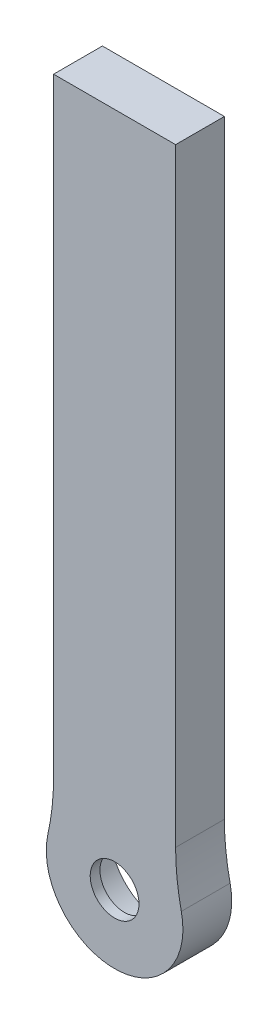
ISO-10303-21;
HEADER;
FILE_DESCRIPTION(('STEP AP214'),'2;1');
FILE_NAME('part.step','',(''),(''),'','','');
FILE_SCHEMA(('AUTOMOTIVE_DESIGN { 1 0 10303 214 1 1 1 1 }'));
ENDSEC;
DATA;
#1=APPLICATION_CONTEXT('core data for automotive mechanical design processes');
#2=APPLICATION_PROTOCOL_DEFINITION('international standard','automotive_design',2000,#1);
#3=PRODUCT_CONTEXT('',#1,'mechanical');
#4=PRODUCT('Part','Part','',(#3));
#5=PRODUCT_RELATED_PRODUCT_CATEGORY('part','',(#4));
#6=PRODUCT_DEFINITION_FORMATION('','',#4);
#7=PRODUCT_DEFINITION_CONTEXT('part definition',#1,'design');
#8=PRODUCT_DEFINITION('design','',#6,#7);
#9=PRODUCT_DEFINITION_SHAPE('','',#8);
#10=(LENGTH_UNIT() NAMED_UNIT(*) SI_UNIT(.MILLI.,.METRE.));
#11=(NAMED_UNIT(*) PLANE_ANGLE_UNIT() SI_UNIT($,.RADIAN.));
#12=(NAMED_UNIT(*) SI_UNIT($,.STERADIAN.) SOLID_ANGLE_UNIT());
#13=UNCERTAINTY_MEASURE_WITH_UNIT(LENGTH_MEASURE(1.E-05),#10,'distance_accuracy_value','');
#14=(GEOMETRIC_REPRESENTATION_CONTEXT(3) GLOBAL_UNCERTAINTY_ASSIGNED_CONTEXT((#13)) GLOBAL_UNIT_ASSIGNED_CONTEXT((#10,
#11,#12)) REPRESENTATION_CONTEXT('',''));
#15=CARTESIAN_POINT('',(0.,0.,0.));
#16=DIRECTION('',(0.,0.,1.));
#17=DIRECTION('',(1.,0.,0.));
#18=AXIS2_PLACEMENT_3D('',#15,#16,#17);
#19=CARTESIAN_POINT('',(0.,0.,0.));
#20=DIRECTION('',(0.,0.,1.));
#21=DIRECTION('',(1.,0.,0.));
#22=AXIS2_PLACEMENT_3D('',#19,#20,#21);
#23=PLANE('',#22);
#24=CARTESIAN_POINT('',(8.5,128.,0.));
#25=DIRECTION('',(0.,0.,1.));
#26=DIRECTION('',(1.,0.,0.));
#27=AXIS2_PLACEMENT_3D('',#24,#25,#26);
#28=CIRCLE('',#27,4.);
#29=CARTESIAN_POINT('',(8.5,132.,0.));
#30=VERTEX_POINT('',#29);
#31=CARTESIAN_POINT('',(12.5,128.,0.));
#32=VERTEX_POINT('',#31);
#33=EDGE_CURVE('E48',#30,#32,#28,.F.);
#34=ORIENTED_EDGE('',*,*,#33,.F.);
#35=DIRECTION('',(1.,0.,0.));
#36=VECTOR('',#35,1.);
#37=CARTESIAN_POINT('',(0.,132.,0.));
#38=LINE('',#37,#36);
#39=CARTESIAN_POINT('',(-8.5,132.,0.));
#40=VERTEX_POINT('',#39);
#41=EDGE_CURVE('E60',#30,#40,#38,.F.);
#42=ORIENTED_EDGE('',*,*,#41,.T.);
#43=CARTESIAN_POINT('',(-8.5,128.,0.));
#44=DIRECTION('',(0.,0.,1.));
#45=DIRECTION('',(1.,0.,0.));
#46=AXIS2_PLACEMENT_3D('',#43,#44,#45);
#47=CIRCLE('',#46,4.);
#48=CARTESIAN_POINT('',(-12.5,128.,0.));
#49=VERTEX_POINT('',#48);
#50=EDGE_CURVE('E260',#49,#40,#47,.F.);
#51=ORIENTED_EDGE('',*,*,#50,.F.);
#52=DIRECTION('',(0.,1.,0.));
#53=VECTOR('',#52,1.);
#54=CARTESIAN_POINT('',(-12.5,0.,0.));
#55=LINE('',#54,#53);
#56=CARTESIAN_POINT('',(-12.5,138.478281378197,0.));
#57=VERTEX_POINT('',#56);
#58=EDGE_CURVE('E183',#49,#57,#55,.T.);
#59=ORIENTED_EDGE('',*,*,#58,.T.);
#60=DIRECTION('',(1.,0.,0.));
#61=VECTOR('',#60,1.);
#62=CARTESIAN_POINT('',(0.,138.478281378197,0.));
#63=LINE('',#62,#61);
#64=CARTESIAN_POINT('',(12.5,138.478281378197,0.));
#65=VERTEX_POINT('',#64);
#66=EDGE_CURVE('E209',#57,#65,#63,.T.);
#67=ORIENTED_EDGE('',*,*,#66,.T.);
#68=DIRECTION('',(0.,1.,0.));
#69=VECTOR('',#68,1.);
#70=CARTESIAN_POINT('',(12.5,0.,0.));
#71=LINE('',#70,#69);
#72=EDGE_CURVE('E205',#32,#65,#71,.T.);
#73=ORIENTED_EDGE('',*,*,#72,.F.);
#74=EDGE_LOOP('',(#34,#42,#51,#59,#67,#73));
#75=FACE_BOUND('',#74,.T.);
#76=ADVANCED_FACE('F39',(#75),#23,.F.);
#77=CARTESIAN_POINT('',(-12.5,0.,10.));
#78=DIRECTION('',(-1.,0.,0.));
#79=DIRECTION('',(0.,0.,1.));
#80=AXIS2_PLACEMENT_3D('',#77,#78,#79);
#81=PLANE('',#80);
#82=CARTESIAN_POINT('',(-12.5,13.7749773139559,0.));
#83=VERTEX_POINT('',#82);
#84=CARTESIAN_POINT('',(-12.5,18.,0.));
#85=VERTEX_POINT('',#84);
#86=EDGE_CURVE('E198',#83,#85,#55,.T.);
#87=ORIENTED_EDGE('',*,*,#86,.F.);
#88=DIRECTION('',(0.,0.,-1.));
#89=VECTOR('',#88,1.);
#90=CARTESIAN_POINT('',(-12.5,13.7749773139559,10.));
#91=LINE('',#90,#89);
#92=CARTESIAN_POINT('',(-12.5,13.7749773139559,10.));
#93=VERTEX_POINT('',#92);
#94=EDGE_CURVE('E228',#83,#93,#91,.F.);
#95=ORIENTED_EDGE('',*,*,#94,.T.);
#96=DIRECTION('',(0.,1.,0.));
#97=VECTOR('',#96,1.);
#98=CARTESIAN_POINT('',(-12.5,0.,10.));
#99=LINE('',#98,#97);
#100=CARTESIAN_POINT('',(-12.5,138.478281378197,10.));
#101=VERTEX_POINT('',#100);
#102=EDGE_CURVE('E186',#93,#101,#99,.T.);
#103=ORIENTED_EDGE('',*,*,#102,.T.);
#104=DIRECTION('',(0.,0.,-1.));
#105=VECTOR('',#104,1.);
#106=CARTESIAN_POINT('',(-12.5,138.478281378197,10.));
#107=LINE('',#106,#105);
#108=EDGE_CURVE('E197',#101,#57,#107,.T.);
#109=ORIENTED_EDGE('',*,*,#108,.T.);
#110=ORIENTED_EDGE('',*,*,#58,.F.);
#111=EDGE_CURVE('E202',#85,#49,#55,.T.);
#112=ORIENTED_EDGE('',*,*,#111,.F.);
#113=EDGE_LOOP('',(#87,#95,#103,#109,#110,#112));
#114=FACE_BOUND('',#113,.T.);
#115=ADVANCED_FACE('F321',(#114),#81,.T.);
#116=CARTESIAN_POINT('',(0.,0.,10.));
#117=DIRECTION('',(0.,0.,-1.));
#118=DIRECTION('',(-1.,0.,0.));
#119=AXIS2_PLACEMENT_3D('',#116,#117,#118);
#120=CYLINDRICAL_SURFACE('',#119,14.);
#121=CARTESIAN_POINT('',(0.,0.,10.));
#122=DIRECTION('',(0.,0.,1.));
#123=DIRECTION('',(1.,0.,0.));
#124=AXIS2_PLACEMENT_3D('',#121,#122,#123);
#125=CIRCLE('',#124,14.);
#126=CARTESIAN_POINT('',(-13.671875,3.01327628742785,10.));
#127=VERTEX_POINT('',#126);
#128=CARTESIAN_POINT('',(13.671875,3.01327628742785,10.));
#129=VERTEX_POINT('',#128);
#130=EDGE_CURVE('E188',#127,#129,#125,.T.);
#131=ORIENTED_EDGE('',*,*,#130,.F.);
#132=DIRECTION('',(0.,0.,-1.));
#133=VECTOR('',#132,1.);
#134=CARTESIAN_POINT('',(-13.671875,3.01327628742785,10.));
#135=LINE('',#134,#133);
#136=CARTESIAN_POINT('',(-13.671875,3.01327628742785,0.));
#137=VERTEX_POINT('',#136);
#138=EDGE_CURVE('E225',#127,#137,#135,.T.);
#139=ORIENTED_EDGE('',*,*,#138,.T.);
#140=CARTESIAN_POINT('',(0.,0.,0.));
#141=DIRECTION('',(0.,0.,1.));
#142=DIRECTION('',(1.,0.,0.));
#143=AXIS2_PLACEMENT_3D('',#140,#141,#142);
#144=CIRCLE('',#143,14.);
#145=CARTESIAN_POINT('',(13.671875,3.01327628742785,0.));
#146=VERTEX_POINT('',#145);
#147=EDGE_CURVE('E201',#137,#146,#144,.T.);
#148=ORIENTED_EDGE('',*,*,#147,.T.);
#149=DIRECTION('',(0.,0.,-1.));
#150=VECTOR('',#149,1.);
#151=CARTESIAN_POINT('',(13.671875,3.01327628742785,10.));
#152=LINE('',#151,#150);
#153=EDGE_CURVE('E223',#146,#129,#152,.F.);
#154=ORIENTED_EDGE('',*,*,#153,.T.);
#155=EDGE_LOOP('',(#131,#139,#148,#154));
#156=FACE_BOUND('',#155,.T.);
#157=ADVANCED_FACE('F327',(#156),#120,.T.);
#158=CARTESIAN_POINT('',(12.5,0.,10.));
#159=DIRECTION('',(-1.,0.,0.));
#160=DIRECTION('',(0.,0.,1.));
#161=AXIS2_PLACEMENT_3D('',#158,#159,#160);
#162=PLANE('',#161);
#163=DIRECTION('',(0.,1.,0.));
#164=VECTOR('',#163,1.);
#165=CARTESIAN_POINT('',(12.5,0.,10.));
#166=LINE('',#165,#164);
#167=CARTESIAN_POINT('',(12.5,13.7749773139559,10.));
#168=VERTEX_POINT('',#167);
#169=CARTESIAN_POINT('',(12.5,138.478281378197,10.));
#170=VERTEX_POINT('',#169);
#171=EDGE_CURVE('E192',#168,#170,#166,.T.);
#172=ORIENTED_EDGE('',*,*,#171,.F.);
#173=DIRECTION('',(0.,0.,1.));
#174=VECTOR('',#173,1.);
#175=CARTESIAN_POINT('',(12.5,13.7749773139559,0.));
#176=LINE('',#175,#174);
#177=CARTESIAN_POINT('',(12.5,13.7749773139559,0.));
#178=VERTEX_POINT('',#177);
#179=EDGE_CURVE('E230',#168,#178,#176,.F.);
#180=ORIENTED_EDGE('',*,*,#179,.T.);
#181=CARTESIAN_POINT('',(12.5,18.,0.));
#182=VERTEX_POINT('',#181);
#183=EDGE_CURVE('E206',#178,#182,#71,.T.);
#184=ORIENTED_EDGE('',*,*,#183,.T.);
#185=EDGE_CURVE('E210',#182,#32,#71,.T.);
#186=ORIENTED_EDGE('',*,*,#185,.T.);
#187=ORIENTED_EDGE('',*,*,#72,.T.);
#188=DIRECTION('',(0.,0.,-1.));
#189=VECTOR('',#188,1.);
#190=CARTESIAN_POINT('',(12.5,138.478281378197,10.));
#191=LINE('',#190,#189);
#192=EDGE_CURVE('E217',#170,#65,#191,.T.);
#193=ORIENTED_EDGE('',*,*,#192,.F.);
#194=EDGE_LOOP('',(#172,#180,#184,#186,#187,#193));
#195=FACE_BOUND('',#194,.T.);
#196=ADVANCED_FACE('F356',(#195),#162,.F.);
#197=CARTESIAN_POINT('',(0.,138.478281378197,10.));
#198=DIRECTION('',(0.,1.,0.));
#199=DIRECTION('',(0.,0.,1.));
#200=AXIS2_PLACEMENT_3D('',#197,#198,#199);
#201=PLANE('',#200);
#202=ORIENTED_EDGE('',*,*,#66,.F.);
#203=ORIENTED_EDGE('',*,*,#108,.F.);
#204=DIRECTION('',(1.,0.,0.));
#205=VECTOR('',#204,1.);
#206=CARTESIAN_POINT('',(0.,138.478281378197,10.));
#207=LINE('',#206,#205);
#208=EDGE_CURVE('E194',#101,#170,#207,.T.);
#209=ORIENTED_EDGE('',*,*,#208,.T.);
#210=ORIENTED_EDGE('',*,*,#192,.T.);
#211=EDGE_LOOP('',(#202,#203,#209,#210));
#212=FACE_BOUND('',#211,.T.);
#213=ADVANCED_FACE('F351',(#212),#201,.T.);
#214=CARTESIAN_POINT('',(0.,0.,10.));
#215=DIRECTION('',(0.,0.,-1.));
#216=DIRECTION('',(-1.,0.,0.));
#217=AXIS2_PLACEMENT_3D('',#214,#215,#216);
#218=CYLINDRICAL_SURFACE('',#217,11.);
#219=CARTESIAN_POINT('',(0.,0.,8.));
#220=DIRECTION('',(0.,0.,-1.));
#221=DIRECTION('',(-1.,0.,0.));
#222=AXIS2_PLACEMENT_3D('',#219,#220,#221);
#223=CIRCLE('',#222,11.);
#224=CARTESIAN_POINT('',(-11.,0.,8.));
#225=VERTEX_POINT('',#224);
#226=EDGE_CURVE('E220',#225,#225,#223,.T.);
#227=ORIENTED_EDGE('',*,*,#226,.F.);
#228=EDGE_LOOP('',(#227));
#229=FACE_BOUND('',#228,.T.);
#230=CARTESIAN_POINT('',(0.,0.,0.));
#231=DIRECTION('',(0.,0.,1.));
#232=DIRECTION('',(1.,0.,0.));
#233=AXIS2_PLACEMENT_3D('',#230,#231,#232);
#234=CIRCLE('',#233,11.);
#235=CARTESIAN_POINT('',(11.,0.,0.));
#236=VERTEX_POINT('',#235);
#237=EDGE_CURVE('E189',#236,#236,#234,.T.);
#238=ORIENTED_EDGE('',*,*,#237,.F.);
#239=EDGE_LOOP('',(#238));
#240=FACE_BOUND('',#239,.T.);
#241=ADVANCED_FACE('F343',(#229,#240),#218,.F.);
#242=CARTESIAN_POINT('',(0.,0.,10.));
#243=DIRECTION('',(0.,0.,1.));
#244=DIRECTION('',(1.,0.,0.));
#245=AXIS2_PLACEMENT_3D('',#242,#243,#244);
#246=PLANE('',#245);
#247=ORIENTED_EDGE('',*,*,#102,.F.);
#248=CARTESIAN_POINT('',(-62.5,13.7749773139559,10.));
#249=DIRECTION('',(0.,0.,1.));
#250=DIRECTION('',(1.,0.,0.));
#251=AXIS2_PLACEMENT_3D('',#248,#249,#250);
#252=CIRCLE('',#251,50.);
#253=EDGE_CURVE('E235',#93,#127,#252,.F.);
#254=ORIENTED_EDGE('',*,*,#253,.T.);
#255=ORIENTED_EDGE('',*,*,#130,.T.);
#256=CARTESIAN_POINT('',(62.5,13.7749773139559,10.));
#257=DIRECTION('',(0.,0.,1.));
#258=DIRECTION('',(1.,0.,0.));
#259=AXIS2_PLACEMENT_3D('',#256,#257,#258);
#260=CIRCLE('',#259,50.);
#261=EDGE_CURVE('E239',#129,#168,#260,.F.);
#262=ORIENTED_EDGE('',*,*,#261,.T.);
#263=ORIENTED_EDGE('',*,*,#171,.T.);
#264=ORIENTED_EDGE('',*,*,#208,.F.);
#265=EDGE_LOOP('',(#247,#254,#255,#262,#263,#264));
#266=FACE_BOUND('',#265,.T.);
#267=CARTESIAN_POINT('',(0.,0.,10.));
#268=DIRECTION('',(0.,0.,-1.));
#269=DIRECTION('',(-1.,0.,0.));
#270=AXIS2_PLACEMENT_3D('',#267,#268,#269);
#271=CIRCLE('',#270,5.);
#272=CARTESIAN_POINT('',(-5.,0.,10.));
#273=VERTEX_POINT('',#272);
#274=EDGE_CURVE('E179',#273,#273,#271,.T.);
#275=ORIENTED_EDGE('',*,*,#274,.T.);
#276=EDGE_LOOP('',(#275));
#277=FACE_BOUND('',#276,.T.);
#278=ADVANCED_FACE('F334',(#266,#277),#246,.T.);
#279=ORIENTED_EDGE('',*,*,#86,.T.);
#280=DIRECTION('',(-1.,0.,0.));
#281=VECTOR('',#280,1.);
#282=CARTESIAN_POINT('',(0.,18.,0.));
#283=LINE('',#282,#281);
#284=EDGE_CURVE('E12',#85,#182,#283,.F.);
#285=ORIENTED_EDGE('',*,*,#284,.T.);
#286=ORIENTED_EDGE('',*,*,#183,.F.);
#287=CARTESIAN_POINT('',(62.5,13.7749773139559,0.));
#288=DIRECTION('',(0.,0.,1.));
#289=DIRECTION('',(1.,0.,0.));
#290=AXIS2_PLACEMENT_3D('',#287,#288,#289);
#291=CIRCLE('',#290,50.);
#292=EDGE_CURVE('E237',#178,#146,#291,.T.);
#293=ORIENTED_EDGE('',*,*,#292,.T.);
#294=ORIENTED_EDGE('',*,*,#147,.F.);
#295=CARTESIAN_POINT('',(-62.5,13.7749773139559,0.));
#296=DIRECTION('',(0.,0.,1.));
#297=DIRECTION('',(1.,0.,0.));
#298=AXIS2_PLACEMENT_3D('',#295,#296,#297);
#299=CIRCLE('',#298,50.);
#300=EDGE_CURVE('E233',#137,#83,#299,.T.);
#301=ORIENTED_EDGE('',*,*,#300,.T.);
#302=EDGE_LOOP('',(#279,#285,#286,#293,#294,#301));
#303=FACE_BOUND('',#302,.T.);
#304=ORIENTED_EDGE('',*,*,#237,.T.);
#305=EDGE_LOOP('',(#304));
#306=FACE_BOUND('',#305,.T.);
#307=ADVANCED_FACE('F323',(#303,#306),#23,.F.);
#308=CARTESIAN_POINT('',(0.,0.,8.));
#309=DIRECTION('',(0.,0.,-1.));
#310=DIRECTION('',(-1.,0.,0.));
#311=AXIS2_PLACEMENT_3D('',#308,#309,#310);
#312=PLANE('',#311);
#313=ORIENTED_EDGE('',*,*,#226,.T.);
#314=EDGE_LOOP('',(#313));
#315=FACE_BOUND('',#314,.T.);
#316=CARTESIAN_POINT('',(0.,0.,8.));
#317=DIRECTION('',(0.,0.,-1.));
#318=DIRECTION('',(-1.,0.,0.));
#319=AXIS2_PLACEMENT_3D('',#316,#317,#318);
#320=CIRCLE('',#319,5.);
#321=CARTESIAN_POINT('',(-5.,0.,8.));
#322=VERTEX_POINT('',#321);
#323=EDGE_CURVE('E180',#322,#322,#320,.T.);
#324=ORIENTED_EDGE('',*,*,#323,.F.);
#325=EDGE_LOOP('',(#324));
#326=FACE_BOUND('',#325,.T.);
#327=ADVANCED_FACE('F333',(#315,#326),#312,.T.);
#328=CARTESIAN_POINT('',(0.,0.,8.));
#329=DIRECTION('',(0.,0.,1.));
#330=DIRECTION('',(1.,0.,0.));
#331=AXIS2_PLACEMENT_3D('',#328,#329,#330);
#332=CYLINDRICAL_SURFACE('',#331,5.);
#333=ORIENTED_EDGE('',*,*,#323,.T.);
#334=EDGE_LOOP('',(#333));
#335=FACE_BOUND('',#334,.T.);
#336=ORIENTED_EDGE('',*,*,#274,.F.);
#337=EDGE_LOOP('',(#336));
#338=FACE_BOUND('',#337,.T.);
#339=ADVANCED_FACE('F340',(#335,#338),#332,.F.);
#340=CARTESIAN_POINT('',(0.,0.,8.));
#341=DIRECTION('',(0.,0.,1.));
#342=DIRECTION('',(1.,0.,0.));
#343=AXIS2_PLACEMENT_3D('',#340,#341,#342);
#344=PLANE('',#343);
#345=DIRECTION('',(0.,1.,0.));
#346=VECTOR('',#345,1.);
#347=CARTESIAN_POINT('',(-10.5,130.,8.00000000000001));
#348=LINE('',#347,#346);
#349=CARTESIAN_POINT('',(-10.5,20.,8.00000000000001));
#350=VERTEX_POINT('',#349);
#351=CARTESIAN_POINT('',(-10.5,128.,8.00000000000001));
#352=VERTEX_POINT('',#351);
#353=EDGE_CURVE('E146',#350,#352,#348,.T.);
#354=ORIENTED_EDGE('',*,*,#353,.T.);
#355=CARTESIAN_POINT('',(-8.5,128.,8.00000000000001));
#356=DIRECTION('',(0.,0.,1.));
#357=DIRECTION('',(1.,0.,0.));
#358=AXIS2_PLACEMENT_3D('',#355,#356,#357);
#359=CIRCLE('',#358,2.);
#360=CARTESIAN_POINT('',(-8.5,130.,8.00000000000001));
#361=VERTEX_POINT('',#360);
#362=EDGE_CURVE('E253',#352,#361,#359,.F.);
#363=ORIENTED_EDGE('',*,*,#362,.T.);
#364=DIRECTION('',(1.,0.,0.));
#365=VECTOR('',#364,1.);
#366=CARTESIAN_POINT('',(10.5,130.,8.00000000000001));
#367=LINE('',#366,#365);
#368=CARTESIAN_POINT('',(8.5,130.,8.00000000000001));
#369=VERTEX_POINT('',#368);
#370=EDGE_CURVE('E156',#361,#369,#367,.T.);
#371=ORIENTED_EDGE('',*,*,#370,.T.);
#372=CARTESIAN_POINT('',(8.5,128.,8.00000000000001));
#373=DIRECTION('',(0.,0.,1.));
#374=DIRECTION('',(1.,0.,0.));
#375=AXIS2_PLACEMENT_3D('',#372,#373,#374);
#376=CIRCLE('',#375,2.);
#377=CARTESIAN_POINT('',(10.5,128.,8.00000000000001));
#378=VERTEX_POINT('',#377);
#379=EDGE_CURVE('E251',#369,#378,#376,.F.);
#380=ORIENTED_EDGE('',*,*,#379,.T.);
#381=DIRECTION('',(0.,-1.,0.));
#382=VECTOR('',#381,1.);
#383=CARTESIAN_POINT('',(10.5,130.,8.00000000000001));
#384=LINE('',#383,#382);
#385=CARTESIAN_POINT('',(10.5,20.,8.00000000000001));
#386=VERTEX_POINT('',#385);
#387=EDGE_CURVE('E169',#378,#386,#384,.T.);
#388=ORIENTED_EDGE('',*,*,#387,.T.);
#389=DIRECTION('',(-1.,0.,0.));
#390=VECTOR('',#389,1.);
#391=CARTESIAN_POINT('',(10.5,20.,8.00000000000001));
#392=LINE('',#391,#390);
#393=EDGE_CURVE('E162',#386,#350,#392,.T.);
#394=ORIENTED_EDGE('',*,*,#393,.T.);
#395=EDGE_LOOP('',(#354,#363,#371,#380,#388,#394));
#396=FACE_BOUND('',#395,.T.);
#397=ADVANCED_FACE('F167',(#396),#344,.F.);
#398=CARTESIAN_POINT('',(10.5,20.,121.986606342009));
#399=DIRECTION('',(0.,-1.,0.));
#400=DIRECTION('',(0.,0.,-1.));
#401=AXIS2_PLACEMENT_3D('',#398,#399,#400);
#402=PLANE('',#401);
#403=DIRECTION('',(0.,0.,-1.));
#404=VECTOR('',#403,1.);
#405=CARTESIAN_POINT('',(10.5,20.,121.986606342009));
#406=LINE('',#405,#404);
#407=CARTESIAN_POINT('',(10.5,20.,2.));
#408=VERTEX_POINT('',#407);
#409=EDGE_CURVE('E175',#386,#408,#406,.T.);
#410=ORIENTED_EDGE('',*,*,#409,.T.);
#411=DIRECTION('',(-1.,0.,0.));
#412=VECTOR('',#411,1.);
#413=CARTESIAN_POINT('',(10.5,20.,2.));
#414=LINE('',#413,#412);
#415=CARTESIAN_POINT('',(-10.5,20.,2.));
#416=VERTEX_POINT('',#415);
#417=EDGE_CURVE('E165',#408,#416,#414,.T.);
#418=ORIENTED_EDGE('',*,*,#417,.T.);
#419=DIRECTION('',(0.,0.,-1.));
#420=VECTOR('',#419,1.);
#421=CARTESIAN_POINT('',(-10.5,20.,121.986606342009));
#422=LINE('',#421,#420);
#423=EDGE_CURVE('E149',#350,#416,#422,.T.);
#424=ORIENTED_EDGE('',*,*,#423,.F.);
#425=ORIENTED_EDGE('',*,*,#393,.F.);
#426=EDGE_LOOP('',(#410,#418,#424,#425));
#427=FACE_BOUND('',#426,.T.);
#428=ADVANCED_FACE('F161',(#427),#402,.F.);
#429=CARTESIAN_POINT('',(-10.5,130.,121.986606342009));
#430=DIRECTION('',(-1.,0.,0.));
#431=DIRECTION('',(0.,-1.,0.));
#432=AXIS2_PLACEMENT_3D('',#429,#430,#431);
#433=PLANE('',#432);
#434=DIRECTION('',(0.,1.,0.));
#435=VECTOR('',#434,1.);
#436=CARTESIAN_POINT('',(-10.5,130.,2.));
#437=LINE('',#436,#435);
#438=CARTESIAN_POINT('',(-10.5,128.,2.));
#439=VERTEX_POINT('',#438);
#440=EDGE_CURVE('E248',#416,#439,#437,.T.);
#441=ORIENTED_EDGE('',*,*,#440,.T.);
#442=DIRECTION('',(0.,0.,-1.));
#443=VECTOR('',#442,1.);
#444=CARTESIAN_POINT('',(-10.5,128.,8.00000000000001));
#445=LINE('',#444,#443);
#446=EDGE_CURVE('E152',#439,#352,#445,.F.);
#447=ORIENTED_EDGE('',*,*,#446,.T.);
#448=ORIENTED_EDGE('',*,*,#353,.F.);
#449=ORIENTED_EDGE('',*,*,#423,.T.);
#450=EDGE_LOOP('',(#441,#447,#448,#449));
#451=FACE_BOUND('',#450,.T.);
#452=ADVANCED_FACE('F148',(#451),#433,.F.);
#453=CARTESIAN_POINT('',(10.5,130.,121.986606342009));
#454=DIRECTION('',(0.,1.,0.));
#455=DIRECTION('',(0.,0.,1.));
#456=AXIS2_PLACEMENT_3D('',#453,#454,#455);
#457=PLANE('',#456);
#458=ORIENTED_EDGE('',*,*,#370,.F.);
#459=DIRECTION('',(0.,0.,-1.));
#460=VECTOR('',#459,1.);
#461=CARTESIAN_POINT('',(-8.5,130.,0.));
#462=LINE('',#461,#460);
#463=CARTESIAN_POINT('',(-8.5,130.,2.));
#464=VERTEX_POINT('',#463);
#465=EDGE_CURVE('E245',#361,#464,#462,.T.);
#466=ORIENTED_EDGE('',*,*,#465,.T.);
#467=DIRECTION('',(1.,0.,0.));
#468=VECTOR('',#467,1.);
#469=CARTESIAN_POINT('',(10.5,130.,2.));
#470=LINE('',#469,#468);
#471=CARTESIAN_POINT('',(8.5,130.,2.));
#472=VERTEX_POINT('',#471);
#473=EDGE_CURVE('E241',#464,#472,#470,.T.);
#474=ORIENTED_EDGE('',*,*,#473,.T.);
#475=DIRECTION('',(0.,0.,-1.));
#476=VECTOR('',#475,1.);
#477=CARTESIAN_POINT('',(8.5,130.,8.00000000000001));
#478=LINE('',#477,#476);
#479=EDGE_CURVE('E243',#472,#369,#478,.F.);
#480=ORIENTED_EDGE('',*,*,#479,.T.);
#481=EDGE_LOOP('',(#458,#466,#474,#480));
#482=FACE_BOUND('',#481,.T.);
#483=ADVANCED_FACE('F298',(#482),#457,.F.);
#484=CARTESIAN_POINT('',(10.5,130.,121.986606342009));
#485=DIRECTION('',(1.,0.,0.));
#486=DIRECTION('',(0.,1.,0.));
#487=AXIS2_PLACEMENT_3D('',#484,#485,#486);
#488=PLANE('',#487);
#489=ORIENTED_EDGE('',*,*,#387,.F.);
#490=DIRECTION('',(0.,0.,-1.));
#491=VECTOR('',#490,1.);
#492=CARTESIAN_POINT('',(10.5,128.,0.));
#493=LINE('',#492,#491);
#494=CARTESIAN_POINT('',(10.5,128.,2.));
#495=VERTEX_POINT('',#494);
#496=EDGE_CURVE('E257',#378,#495,#493,.T.);
#497=ORIENTED_EDGE('',*,*,#496,.T.);
#498=DIRECTION('',(0.,-1.,0.));
#499=VECTOR('',#498,1.);
#500=CARTESIAN_POINT('',(10.5,130.,2.));
#501=LINE('',#500,#499);
#502=EDGE_CURVE('E255',#495,#408,#501,.T.);
#503=ORIENTED_EDGE('',*,*,#502,.T.);
#504=ORIENTED_EDGE('',*,*,#409,.F.);
#505=EDGE_LOOP('',(#489,#497,#503,#504));
#506=FACE_BOUND('',#505,.T.);
#507=ADVANCED_FACE('F371',(#506),#488,.F.);
#508=CARTESIAN_POINT('',(-62.5,13.7749773139559,10.));
#509=DIRECTION('',(0.,0.,-1.));
#510=DIRECTION('',(-1.,0.,0.));
#511=AXIS2_PLACEMENT_3D('',#508,#509,#510);
#512=CYLINDRICAL_SURFACE('',#511,50.);
#513=ORIENTED_EDGE('',*,*,#253,.F.);
#514=ORIENTED_EDGE('',*,*,#94,.F.);
#515=ORIENTED_EDGE('',*,*,#300,.F.);
#516=ORIENTED_EDGE('',*,*,#138,.F.);
#517=EDGE_LOOP('',(#513,#514,#515,#516));
#518=FACE_BOUND('',#517,.T.);
#519=ADVANCED_FACE('F367',(#518),#512,.F.);
#520=CARTESIAN_POINT('',(62.5,13.7749773139559,10.));
#521=DIRECTION('',(0.,0.,-1.));
#522=DIRECTION('',(-1.,0.,0.));
#523=AXIS2_PLACEMENT_3D('',#520,#521,#522);
#524=CYLINDRICAL_SURFACE('',#523,50.);
#525=ORIENTED_EDGE('',*,*,#261,.F.);
#526=ORIENTED_EDGE('',*,*,#153,.F.);
#527=ORIENTED_EDGE('',*,*,#292,.F.);
#528=ORIENTED_EDGE('',*,*,#179,.F.);
#529=EDGE_LOOP('',(#525,#526,#527,#528));
#530=FACE_BOUND('',#529,.T.);
#531=ADVANCED_FACE('F370',(#530),#524,.F.);
#532=CARTESIAN_POINT('',(8.5,128.,121.986606342009));
#533=DIRECTION('',(0.,0.,1.));
#534=DIRECTION('',(1.,0.,0.));
#535=AXIS2_PLACEMENT_3D('',#532,#533,#534);
#536=CYLINDRICAL_SURFACE('',#535,2.);
#537=ORIENTED_EDGE('',*,*,#379,.F.);
#538=ORIENTED_EDGE('',*,*,#479,.F.);
#539=CARTESIAN_POINT('',(8.5,128.,2.));
#540=DIRECTION('',(0.,0.,1.));
#541=DIRECTION('',(1.,0.,0.));
#542=AXIS2_PLACEMENT_3D('',#539,#540,#541);
#543=CIRCLE('',#542,2.);
#544=EDGE_CURVE('E43',#495,#472,#543,.T.);
#545=ORIENTED_EDGE('',*,*,#544,.F.);
#546=ORIENTED_EDGE('',*,*,#496,.F.);
#547=EDGE_LOOP('',(#537,#538,#545,#546));
#548=FACE_BOUND('',#547,.T.);
#549=ADVANCED_FACE('F41',(#548),#536,.F.);
#550=CARTESIAN_POINT('',(12.5,130.,2.));
#551=DIRECTION('',(0.,-1.,0.));
#552=DIRECTION('',(1.,0.,0.));
#553=AXIS2_PLACEMENT_3D('',#550,#551,#552);
#554=CYLINDRICAL_SURFACE('',#553,2.);
#555=CARTESIAN_POINT('',(12.5,18.,2.));
#556=DIRECTION('',(-0.707106781186548,-0.707106781186547,0.));
#557=DIRECTION('',(-0.707106781186547,0.707106781186548,0.));
#558=AXIS2_PLACEMENT_3D('',#555,#556,#557);
#559=ELLIPSE('',#558,2.82842712474619,2.);
#560=EDGE_CURVE('E279',#408,#182,#559,.T.);
#561=ORIENTED_EDGE('',*,*,#560,.F.);
#562=ORIENTED_EDGE('',*,*,#502,.F.);
#563=CARTESIAN_POINT('',(12.5,128.,2.));
#564=DIRECTION('',(0.,1.,0.));
#565=DIRECTION('',(0.,0.,1.));
#566=AXIS2_PLACEMENT_3D('',#563,#564,#565);
#567=CIRCLE('',#566,2.);
#568=EDGE_CURVE('E172',#32,#495,#567,.T.);
#569=ORIENTED_EDGE('',*,*,#568,.F.);
#570=ORIENTED_EDGE('',*,*,#185,.F.);
#571=EDGE_LOOP('',(#561,#562,#569,#570));
#572=FACE_BOUND('',#571,.T.);
#573=ADVANCED_FACE('F289',(#572),#554,.T.);
#574=CARTESIAN_POINT('',(8.5,128.,2.));
#575=DIRECTION('',(0.,0.,1.));
#576=DIRECTION('',(1.,0.,0.));
#577=AXIS2_PLACEMENT_3D('',#574,#575,#576);
#578=TOROIDAL_SURFACE('',#577,4.,2.);
#579=ORIENTED_EDGE('',*,*,#568,.T.);
#580=ORIENTED_EDGE('',*,*,#544,.T.);
#581=CARTESIAN_POINT('',(8.5,132.,2.));
#582=DIRECTION('',(1.,0.,0.));
#583=DIRECTION('',(0.,0.,-1.));
#584=AXIS2_PLACEMENT_3D('',#581,#582,#583);
#585=CIRCLE('',#584,2.);
#586=EDGE_CURVE('E276',#30,#472,#585,.F.);
#587=ORIENTED_EDGE('',*,*,#586,.F.);
#588=ORIENTED_EDGE('',*,*,#33,.T.);
#589=EDGE_LOOP('',(#579,#580,#587,#588));
#590=FACE_BOUND('',#589,.T.);
#591=ADVANCED_FACE('F283',(#590),#578,.T.);
#592=CARTESIAN_POINT('',(10.5,18.,2.));
#593=DIRECTION('',(-1.,0.,0.));
#594=DIRECTION('',(0.,0.,1.));
#595=AXIS2_PLACEMENT_3D('',#592,#593,#594);
#596=CYLINDRICAL_SURFACE('',#595,2.);
#597=ORIENTED_EDGE('',*,*,#560,.T.);
#598=ORIENTED_EDGE('',*,*,#284,.F.);
#599=CARTESIAN_POINT('',(-12.5,18.,2.));
#600=DIRECTION('',(-0.707106781186547,0.707106781186548,0.));
#601=DIRECTION('',(-0.707106781186547,-0.707106781186547,0.));
#602=AXIS2_PLACEMENT_3D('',#599,#600,#601);
#603=ELLIPSE('',#602,2.82842712474619,2.);
#604=EDGE_CURVE('E273',#416,#85,#603,.T.);
#605=ORIENTED_EDGE('',*,*,#604,.F.);
#606=ORIENTED_EDGE('',*,*,#417,.F.);
#607=EDGE_LOOP('',(#597,#598,#605,#606));
#608=FACE_BOUND('',#607,.T.);
#609=ADVANCED_FACE('F310',(#608),#596,.T.);
#610=CARTESIAN_POINT('',(10.5,132.,2.));
#611=DIRECTION('',(1.,0.,0.));
#612=DIRECTION('',(0.,0.,-1.));
#613=AXIS2_PLACEMENT_3D('',#610,#611,#612);
#614=CYLINDRICAL_SURFACE('',#613,2.);
#615=ORIENTED_EDGE('',*,*,#586,.T.);
#616=ORIENTED_EDGE('',*,*,#473,.F.);
#617=CARTESIAN_POINT('',(-8.5,132.,2.));
#618=DIRECTION('',(-1.,0.,0.));
#619=DIRECTION('',(0.,0.,1.));
#620=AXIS2_PLACEMENT_3D('',#617,#618,#619);
#621=CIRCLE('',#620,2.);
#622=EDGE_CURVE('E270',#40,#464,#621,.T.);
#623=ORIENTED_EDGE('',*,*,#622,.F.);
#624=ORIENTED_EDGE('',*,*,#41,.F.);
#625=EDGE_LOOP('',(#615,#616,#623,#624));
#626=FACE_BOUND('',#625,.T.);
#627=ADVANCED_FACE('F307',(#626),#614,.T.);
#628=CARTESIAN_POINT('',(-12.5,130.,2.));
#629=DIRECTION('',(0.,1.,0.));
#630=DIRECTION('',(-1.,0.,0.));
#631=AXIS2_PLACEMENT_3D('',#628,#629,#630);
#632=CYLINDRICAL_SURFACE('',#631,2.);
#633=ORIENTED_EDGE('',*,*,#604,.T.);
#634=ORIENTED_EDGE('',*,*,#111,.T.);
#635=CARTESIAN_POINT('',(-12.5,128.,2.));
#636=DIRECTION('',(0.,1.,0.));
#637=DIRECTION('',(0.,0.,1.));
#638=AXIS2_PLACEMENT_3D('',#635,#636,#637);
#639=CIRCLE('',#638,2.);
#640=EDGE_CURVE('E267',#439,#49,#639,.T.);
#641=ORIENTED_EDGE('',*,*,#640,.F.);
#642=ORIENTED_EDGE('',*,*,#440,.F.);
#643=EDGE_LOOP('',(#633,#634,#641,#642));
#644=FACE_BOUND('',#643,.T.);
#645=ADVANCED_FACE('F309',(#644),#632,.T.);
#646=CARTESIAN_POINT('',(-8.5,128.,2.));
#647=DIRECTION('',(0.,0.,1.));
#648=DIRECTION('',(1.,0.,0.));
#649=AXIS2_PLACEMENT_3D('',#646,#647,#648);
#650=TOROIDAL_SURFACE('',#649,4.,2.);
#651=ORIENTED_EDGE('',*,*,#50,.T.);
#652=ORIENTED_EDGE('',*,*,#622,.T.);
#653=CARTESIAN_POINT('',(-8.5,128.,2.));
#654=DIRECTION('',(0.,0.,1.));
#655=DIRECTION('',(1.,0.,0.));
#656=AXIS2_PLACEMENT_3D('',#653,#654,#655);
#657=CIRCLE('',#656,2.);
#658=EDGE_CURVE('E265',#439,#464,#657,.F.);
#659=ORIENTED_EDGE('',*,*,#658,.F.);
#660=ORIENTED_EDGE('',*,*,#640,.T.);
#661=EDGE_LOOP('',(#651,#652,#659,#660));
#662=FACE_BOUND('',#661,.T.);
#663=ADVANCED_FACE('F305',(#662),#650,.T.);
#664=CARTESIAN_POINT('',(-8.5,128.,121.986606342009));
#665=DIRECTION('',(0.,0.,1.));
#666=DIRECTION('',(1.,0.,0.));
#667=AXIS2_PLACEMENT_3D('',#664,#665,#666);
#668=CYLINDRICAL_SURFACE('',#667,2.);
#669=ORIENTED_EDGE('',*,*,#362,.F.);
#670=ORIENTED_EDGE('',*,*,#446,.F.);
#671=ORIENTED_EDGE('',*,*,#658,.T.);
#672=ORIENTED_EDGE('',*,*,#465,.F.);
#673=EDGE_LOOP('',(#669,#670,#671,#672));
#674=FACE_BOUND('',#673,.T.);
#675=ADVANCED_FACE('F302',(#674),#668,.F.);
#676=CLOSED_SHELL('',(#76,#115,#157,#196,#213,#241,#278,#307,#327,#339,#397,#428,#452,#483,#507,
#519,#531,#549,#573,#591,#609,#627,#645,#663,#675));
#677=MANIFOLD_SOLID_BREP('B2',#676);
#678=ADVANCED_BREP_SHAPE_REPRESENTATION('',(#18,#677),#14);
#679=SHAPE_DEFINITION_REPRESENTATION(#9,#678);
ENDSEC;
END-ISO-10303-21;
